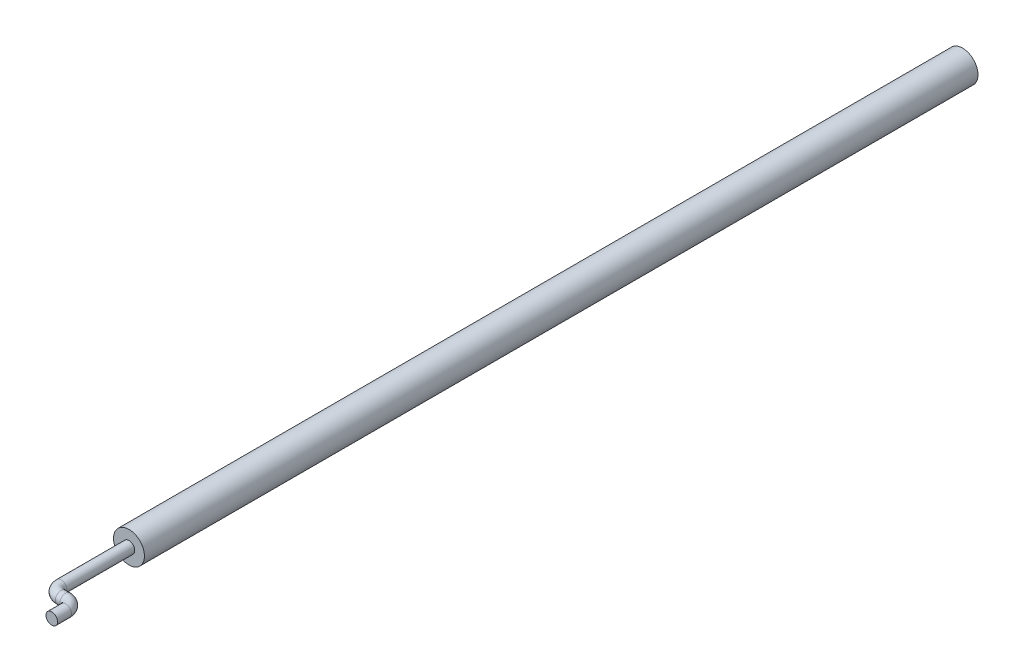
ISO-10303-21;
HEADER;
FILE_DESCRIPTION(('STEP AP214'),'2;1');
FILE_NAME('part.step','',(''),(''),'','','');
FILE_SCHEMA(('AUTOMOTIVE_DESIGN { 1 0 10303 214 1 1 1 1 }'));
ENDSEC;
DATA;
#1=APPLICATION_CONTEXT('core data for automotive mechanical design processes');
#2=APPLICATION_PROTOCOL_DEFINITION('international standard','automotive_design',2000,#1);
#3=PRODUCT_CONTEXT('',#1,'mechanical');
#4=PRODUCT('Part','Part','',(#3));
#5=PRODUCT_RELATED_PRODUCT_CATEGORY('part','',(#4));
#6=PRODUCT_DEFINITION_FORMATION('','',#4);
#7=PRODUCT_DEFINITION_CONTEXT('part definition',#1,'design');
#8=PRODUCT_DEFINITION('design','',#6,#7);
#9=PRODUCT_DEFINITION_SHAPE('','',#8);
#10=(LENGTH_UNIT() NAMED_UNIT(*) SI_UNIT(.MILLI.,.METRE.));
#11=(NAMED_UNIT(*) PLANE_ANGLE_UNIT() SI_UNIT($,.RADIAN.));
#12=(NAMED_UNIT(*) SI_UNIT($,.STERADIAN.) SOLID_ANGLE_UNIT());
#13=UNCERTAINTY_MEASURE_WITH_UNIT(LENGTH_MEASURE(1.E-05),#10,'distance_accuracy_value','');
#14=(GEOMETRIC_REPRESENTATION_CONTEXT(3) GLOBAL_UNCERTAINTY_ASSIGNED_CONTEXT((#13)) GLOBAL_UNIT_ASSIGNED_CONTEXT((#10,
#11,#12)) REPRESENTATION_CONTEXT('',''));
#15=CARTESIAN_POINT('',(0.,0.,0.));
#16=DIRECTION('',(0.,0.,1.));
#17=DIRECTION('',(1.,0.,0.));
#18=AXIS2_PLACEMENT_3D('',#15,#16,#17);
#19=CARTESIAN_POINT('',(0.,0.,2743.2));
#20=DIRECTION('',(0.,0.,-1.));
#21=DIRECTION('',(-1.,0.,0.));
#22=AXIS2_PLACEMENT_3D('',#19,#20,#21);
#23=CYLINDRICAL_SURFACE('',#22,50.8);
#24=CARTESIAN_POINT('',(0.,0.,2743.2));
#25=DIRECTION('',(0.,0.,1.));
#26=DIRECTION('',(1.,0.,0.));
#27=AXIS2_PLACEMENT_3D('',#24,#25,#26);
#28=CIRCLE('',#27,50.8);
#29=CARTESIAN_POINT('',(50.8,0.,2743.2));
#30=VERTEX_POINT('',#29);
#31=EDGE_CURVE('E38',#30,#30,#28,.T.);
#32=ORIENTED_EDGE('',*,*,#31,.F.);
#33=EDGE_LOOP('',(#32));
#34=FACE_BOUND('',#33,.T.);
#35=CARTESIAN_POINT('',(0.,0.,0.));
#36=DIRECTION('',(0.,0.,1.));
#37=DIRECTION('',(1.,0.,0.));
#38=AXIS2_PLACEMENT_3D('',#35,#36,#37);
#39=CIRCLE('',#38,50.8);
#40=CARTESIAN_POINT('',(50.8,0.,0.));
#41=VERTEX_POINT('',#40);
#42=EDGE_CURVE('E34',#41,#41,#39,.T.);
#43=ORIENTED_EDGE('',*,*,#42,.T.);
#44=EDGE_LOOP('',(#43));
#45=FACE_BOUND('',#44,.T.);
#46=ADVANCED_FACE('F31',(#34,#45),#23,.T.);
#47=CARTESIAN_POINT('',(0.,0.,2743.2));
#48=DIRECTION('',(0.,0.,1.));
#49=DIRECTION('',(1.,0.,0.));
#50=AXIS2_PLACEMENT_3D('',#47,#48,#49);
#51=PLANE('',#50);
#52=CARTESIAN_POINT('',(0.,0.,2743.2));
#53=DIRECTION('',(0.,0.,1.));
#54=DIRECTION('',(1.,0.,0.));
#55=AXIS2_PLACEMENT_3D('',#52,#53,#54);
#56=CIRCLE('',#55,19.05);
#57=CARTESIAN_POINT('',(19.05,0.,2743.2));
#58=VERTEX_POINT('',#57);
#59=EDGE_CURVE('E10',#58,#58,#56,.T.);
#60=ORIENTED_EDGE('',*,*,#59,.F.);
#61=EDGE_LOOP('',(#60));
#62=FACE_BOUND('',#61,.T.);
#63=ORIENTED_EDGE('',*,*,#31,.T.);
#64=EDGE_LOOP('',(#63));
#65=FACE_BOUND('',#64,.T.);
#66=ADVANCED_FACE('F67',(#62,#65),#51,.T.);
#67=CARTESIAN_POINT('',(0.,0.,0.));
#68=DIRECTION('',(0.,0.,1.));
#69=DIRECTION('',(1.,0.,0.));
#70=AXIS2_PLACEMENT_3D('',#67,#68,#69);
#71=PLANE('',#70);
#72=ORIENTED_EDGE('',*,*,#42,.F.);
#73=EDGE_LOOP('',(#72));
#74=FACE_BOUND('',#73,.T.);
#75=ADVANCED_FACE('F64',(#74),#71,.F.);
#76=CARTESIAN_POINT('',(76.2,0.,3073.4));
#77=DIRECTION('',(0.,0.,1.));
#78=DIRECTION('',(1.,0.,0.));
#79=AXIS2_PLACEMENT_3D('',#76,#77,#78);
#80=PLANE('',#79);
#81=CARTESIAN_POINT('',(76.2,0.,3073.4));
#82=DIRECTION('',(0.,0.,1.));
#83=DIRECTION('',(1.,0.,0.));
#84=AXIS2_PLACEMENT_3D('',#81,#82,#83);
#85=CIRCLE('',#84,19.05);
#86=CARTESIAN_POINT('',(95.25,0.,3073.4));
#87=VERTEX_POINT('',#86);
#88=EDGE_CURVE('E56',#87,#87,#85,.T.);
#89=ORIENTED_EDGE('',*,*,#88,.T.);
#90=EDGE_LOOP('',(#89));
#91=FACE_BOUND('',#90,.T.);
#92=ADVANCED_FACE('F66',(#91),#80,.T.);
#93=CARTESIAN_POINT('',(0.,0.,2743.2));
#94=DIRECTION('',(0.,0.,1.));
#95=DIRECTION('',(1.,0.,0.));
#96=AXIS2_PLACEMENT_3D('',#93,#94,#95);
#97=CYLINDRICAL_SURFACE('',#96,19.05);
#98=CARTESIAN_POINT('',(0.,0.,2966.72));
#99=DIRECTION('',(0.,0.,1.));
#100=DIRECTION('',(1.,0.,0.));
#101=AXIS2_PLACEMENT_3D('',#98,#99,#100);
#102=CIRCLE('',#101,19.05);
#103=CARTESIAN_POINT('',(-19.0499999999599,0.,2966.72));
#104=VERTEX_POINT('',#103);
#105=EDGE_CURVE('E44',#104,#104,#102,.T.);
#106=ORIENTED_EDGE('',*,*,#105,.F.);
#107=EDGE_LOOP('',(#106));
#108=FACE_BOUND('',#107,.T.);
#109=ORIENTED_EDGE('',*,*,#59,.T.);
#110=EDGE_LOOP('',(#109));
#111=FACE_BOUND('',#110,.T.);
#112=ADVANCED_FACE('F73',(#108,#111),#97,.T.);
#113=CARTESIAN_POINT('',(30.48,0.,2966.72));
#114=DIRECTION('',(0.,1.,0.));
#115=DIRECTION('',(0.,0.,1.));
#116=AXIS2_PLACEMENT_3D('',#113,#114,#115);
#117=TOROIDAL_SURFACE('',#116,30.4799999999599,19.05);
#118=CARTESIAN_POINT('',(30.4799999999998,0.,2997.2));
#119=DIRECTION('',(1.,0.,0.));
#120=DIRECTION('',(0.,0.,-1.));
#121=AXIS2_PLACEMENT_3D('',#118,#119,#120);
#122=CIRCLE('',#121,19.05);
#123=CARTESIAN_POINT('',(30.4799999999997,0.,3016.24999999996));
#124=VERTEX_POINT('',#123);
#125=EDGE_CURVE('E47',#124,#124,#122,.T.);
#126=CARTESIAN_POINT('',(30.48,0.,2966.72));
#127=DIRECTION('',(0.,1.,0.));
#128=DIRECTION('',(0.,0.,1.));
#129=AXIS2_PLACEMENT_3D('',#126,#127,#128);
#130=CIRCLE('',#129,49.5299999999599);
#131=EDGE_CURVE('',#104,#124,#130,.T.);
#132=ORIENTED_EDGE('',*,*,#105,.T.);
#133=ORIENTED_EDGE('',*,*,#125,.F.);
#134=ORIENTED_EDGE('',*,*,#131,.T.);
#135=ORIENTED_EDGE('',*,*,#131,.F.);
#136=EDGE_LOOP('',(#132,#134,#133,#135));
#137=FACE_BOUND('',#136,.T.);
#138=ADVANCED_FACE('F108',(#137),#117,.T.);
#139=CARTESIAN_POINT('',(30.4799999999998,0.,2997.2));
#140=DIRECTION('',(1.,0.,0.));
#141=DIRECTION('',(0.,0.,-1.));
#142=AXIS2_PLACEMENT_3D('',#139,#140,#141);
#143=CYLINDRICAL_SURFACE('',#142,19.05);
#144=CARTESIAN_POINT('',(45.7200000000002,0.,2997.2));
#145=DIRECTION('',(1.,0.,0.));
#146=DIRECTION('',(0.,0.,-1.));
#147=AXIS2_PLACEMENT_3D('',#144,#145,#146);
#148=CIRCLE('',#147,19.05);
#149=CARTESIAN_POINT('',(45.7200000000003,0.,2978.15));
#150=VERTEX_POINT('',#149);
#151=EDGE_CURVE('E50',#150,#150,#148,.T.);
#152=ORIENTED_EDGE('',*,*,#151,.F.);
#153=EDGE_LOOP('',(#152));
#154=FACE_BOUND('',#153,.T.);
#155=ORIENTED_EDGE('',*,*,#125,.T.);
#156=EDGE_LOOP('',(#155));
#157=FACE_BOUND('',#156,.T.);
#158=ADVANCED_FACE('F118',(#154,#157),#143,.T.);
#159=CARTESIAN_POINT('',(45.72,0.,3027.68));
#160=DIRECTION('',(0.,-1.,0.));
#161=DIRECTION('',(0.,0.,-1.));
#162=AXIS2_PLACEMENT_3D('',#159,#160,#161);
#163=TOROIDAL_SURFACE('',#162,30.4799999999998,19.05);
#164=CARTESIAN_POINT('',(76.2000000000399,0.,3027.68));
#165=DIRECTION('',(0.,0.,1.));
#166=DIRECTION('',(1.,0.,0.));
#167=AXIS2_PLACEMENT_3D('',#164,#165,#166);
#168=CIRCLE('',#167,19.05);
#169=CARTESIAN_POINT('',(95.2499999999998,0.,3027.68));
#170=VERTEX_POINT('',#169);
#171=EDGE_CURVE('E53',#170,#170,#168,.T.);
#172=CARTESIAN_POINT('',(45.72,0.,3027.68));
#173=DIRECTION('',(0.,-1.,0.));
#174=DIRECTION('',(0.,0.,-1.));
#175=AXIS2_PLACEMENT_3D('',#172,#173,#174);
#176=CIRCLE('',#175,49.5299999999998);
#177=EDGE_CURVE('',#150,#170,#176,.T.);
#178=ORIENTED_EDGE('',*,*,#151,.T.);
#179=ORIENTED_EDGE('',*,*,#171,.F.);
#180=ORIENTED_EDGE('',*,*,#177,.T.);
#181=ORIENTED_EDGE('',*,*,#177,.F.);
#182=EDGE_LOOP('',(#178,#180,#179,#181));
#183=FACE_BOUND('',#182,.T.);
#184=ADVANCED_FACE('F78',(#183),#163,.T.);
#185=CARTESIAN_POINT('',(76.2,0.,3027.68));
#186=DIRECTION('',(0.,0.,1.));
#187=DIRECTION('',(1.,0.,0.));
#188=AXIS2_PLACEMENT_3D('',#185,#186,#187);
#189=CYLINDRICAL_SURFACE('',#188,19.05);
#190=ORIENTED_EDGE('',*,*,#88,.F.);
#191=EDGE_LOOP('',(#190));
#192=FACE_BOUND('',#191,.T.);
#193=ORIENTED_EDGE('',*,*,#171,.T.);
#194=EDGE_LOOP('',(#193));
#195=FACE_BOUND('',#194,.T.);
#196=ADVANCED_FACE('F68',(#192,#195),#189,.T.);
#197=CLOSED_SHELL('',(#46,#66,#75,#92,#112,#138,#158,#184,#196));
#198=MANIFOLD_SOLID_BREP('B2',#197);
#199=ADVANCED_BREP_SHAPE_REPRESENTATION('',(#18,#198),#14);
#200=SHAPE_DEFINITION_REPRESENTATION(#9,#199);
ENDSEC;
END-ISO-10303-21;
